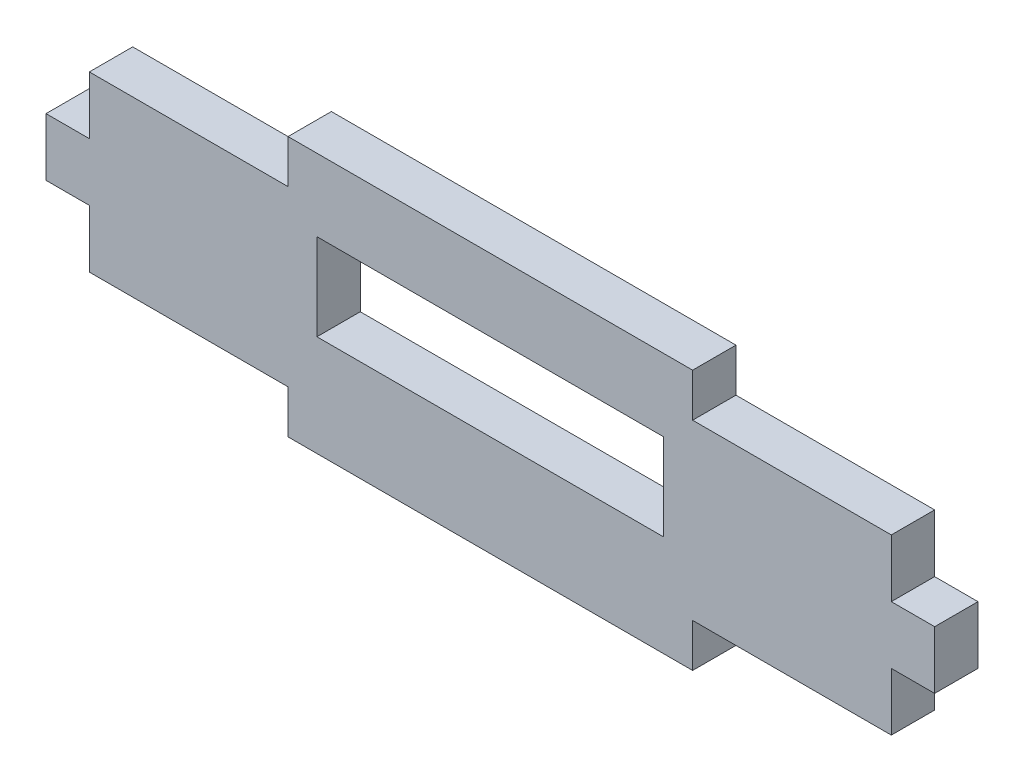
ISO-10303-21;
HEADER;
FILE_DESCRIPTION(('STEP AP214'),'2;1');
FILE_NAME('part.step','',(''),(''),'','','');
FILE_SCHEMA(('AUTOMOTIVE_DESIGN { 1 0 10303 214 1 1 1 1 }'));
ENDSEC;
DATA;
#1=APPLICATION_CONTEXT('core data for automotive mechanical design processes');
#2=APPLICATION_PROTOCOL_DEFINITION('international standard','automotive_design',2000,#1);
#3=PRODUCT_CONTEXT('',#1,'mechanical');
#4=PRODUCT('Part','Part','',(#3));
#5=PRODUCT_RELATED_PRODUCT_CATEGORY('part','',(#4));
#6=PRODUCT_DEFINITION_FORMATION('','',#4);
#7=PRODUCT_DEFINITION_CONTEXT('part definition',#1,'design');
#8=PRODUCT_DEFINITION('design','',#6,#7);
#9=PRODUCT_DEFINITION_SHAPE('','',#8);
#10=(LENGTH_UNIT() NAMED_UNIT(*) SI_UNIT(.MILLI.,.METRE.));
#11=(NAMED_UNIT(*) PLANE_ANGLE_UNIT() SI_UNIT($,.RADIAN.));
#12=(NAMED_UNIT(*) SI_UNIT($,.STERADIAN.) SOLID_ANGLE_UNIT());
#13=UNCERTAINTY_MEASURE_WITH_UNIT(LENGTH_MEASURE(1.E-05),#10,'distance_accuracy_value','');
#14=(GEOMETRIC_REPRESENTATION_CONTEXT(3) GLOBAL_UNCERTAINTY_ASSIGNED_CONTEXT((#13)) GLOBAL_UNIT_ASSIGNED_CONTEXT((#10,
#11,#12)) REPRESENTATION_CONTEXT('',''));
#15=CARTESIAN_POINT('',(0.,0.,0.));
#16=DIRECTION('',(0.,0.,1.));
#17=DIRECTION('',(1.,0.,0.));
#18=AXIS2_PLACEMENT_3D('',#15,#16,#17);
#19=CARTESIAN_POINT('',(0.,0.,3.));
#20=DIRECTION('',(0.,0.,1.));
#21=DIRECTION('',(1.,0.,0.));
#22=AXIS2_PLACEMENT_3D('',#19,#20,#21);
#23=PLANE('',#22);
#24=DIRECTION('',(0.,-1.,0.));
#25=VECTOR('',#24,1.);
#26=CARTESIAN_POINT('',(-14.,-9.,3.));
#27=LINE('',#26,#25);
#28=CARTESIAN_POINT('',(-14.,-6.,3.));
#29=VERTEX_POINT('',#28);
#30=CARTESIAN_POINT('',(-14.,-9.,3.));
#31=VERTEX_POINT('',#30);
#32=EDGE_CURVE('E230',#29,#31,#27,.T.);
#33=ORIENTED_EDGE('',*,*,#32,.T.);
#34=DIRECTION('',(1.,0.,0.));
#35=VECTOR('',#34,1.);
#36=CARTESIAN_POINT('',(-14.,-9.,3.));
#37=LINE('',#36,#35);
#38=CARTESIAN_POINT('',(14.,-9.,3.));
#39=VERTEX_POINT('',#38);
#40=EDGE_CURVE('E233',#31,#39,#37,.T.);
#41=ORIENTED_EDGE('',*,*,#40,.T.);
#42=DIRECTION('',(0.,1.,0.));
#43=VECTOR('',#42,1.);
#44=CARTESIAN_POINT('',(14.,-6.,3.));
#45=LINE('',#44,#43);
#46=CARTESIAN_POINT('',(14.,-6.,3.));
#47=VERTEX_POINT('',#46);
#48=EDGE_CURVE('E236',#39,#47,#45,.T.);
#49=ORIENTED_EDGE('',*,*,#48,.T.);
#50=DIRECTION('',(1.,0.,0.));
#51=VECTOR('',#50,1.);
#52=CARTESIAN_POINT('',(27.75,-6.,3.));
#53=LINE('',#52,#51);
#54=CARTESIAN_POINT('',(27.75,-6.,3.));
#55=VERTEX_POINT('',#54);
#56=EDGE_CURVE('E238',#47,#55,#53,.T.);
#57=ORIENTED_EDGE('',*,*,#56,.T.);
#58=DIRECTION('',(0.,1.,0.));
#59=VECTOR('',#58,1.);
#60=CARTESIAN_POINT('',(27.75,-2.,3.));
#61=LINE('',#60,#59);
#62=CARTESIAN_POINT('',(27.75,-2.,3.));
#63=VERTEX_POINT('',#62);
#64=EDGE_CURVE('E240',#55,#63,#61,.T.);
#65=ORIENTED_EDGE('',*,*,#64,.T.);
#66=DIRECTION('',(1.,0.,0.));
#67=VECTOR('',#66,1.);
#68=CARTESIAN_POINT('',(30.75,-2.,3.));
#69=LINE('',#68,#67);
#70=CARTESIAN_POINT('',(30.75,-2.,3.));
#71=VERTEX_POINT('',#70);
#72=EDGE_CURVE('E242',#63,#71,#69,.T.);
#73=ORIENTED_EDGE('',*,*,#72,.T.);
#74=DIRECTION('',(0.,1.,0.));
#75=VECTOR('',#74,1.);
#76=CARTESIAN_POINT('',(30.75,-2.,3.));
#77=LINE('',#76,#75);
#78=CARTESIAN_POINT('',(30.75,2.,3.));
#79=VERTEX_POINT('',#78);
#80=EDGE_CURVE('E244',#71,#79,#77,.T.);
#81=ORIENTED_EDGE('',*,*,#80,.T.);
#82=DIRECTION('',(-1.,0.,0.));
#83=VECTOR('',#82,1.);
#84=CARTESIAN_POINT('',(30.75,2.,3.));
#85=LINE('',#84,#83);
#86=CARTESIAN_POINT('',(27.75,2.,3.));
#87=VERTEX_POINT('',#86);
#88=EDGE_CURVE('E246',#79,#87,#85,.T.);
#89=ORIENTED_EDGE('',*,*,#88,.T.);
#90=DIRECTION('',(0.,1.,0.));
#91=VECTOR('',#90,1.);
#92=CARTESIAN_POINT('',(27.75,2.,3.));
#93=LINE('',#92,#91);
#94=CARTESIAN_POINT('',(27.75,6.,3.));
#95=VERTEX_POINT('',#94);
#96=EDGE_CURVE('E248',#87,#95,#93,.T.);
#97=ORIENTED_EDGE('',*,*,#96,.T.);
#98=DIRECTION('',(-1.,0.,0.));
#99=VECTOR('',#98,1.);
#100=CARTESIAN_POINT('',(14.,6.,3.));
#101=LINE('',#100,#99);
#102=CARTESIAN_POINT('',(14.,6.,3.));
#103=VERTEX_POINT('',#102);
#104=EDGE_CURVE('E250',#95,#103,#101,.T.);
#105=ORIENTED_EDGE('',*,*,#104,.T.);
#106=DIRECTION('',(0.,1.,0.));
#107=VECTOR('',#106,1.);
#108=CARTESIAN_POINT('',(14.,9.,3.));
#109=LINE('',#108,#107);
#110=CARTESIAN_POINT('',(14.,9.,3.));
#111=VERTEX_POINT('',#110);
#112=EDGE_CURVE('E252',#103,#111,#109,.T.);
#113=ORIENTED_EDGE('',*,*,#112,.T.);
#114=DIRECTION('',(-1.,0.,0.));
#115=VECTOR('',#114,1.);
#116=CARTESIAN_POINT('',(14.,9.,3.));
#117=LINE('',#116,#115);
#118=CARTESIAN_POINT('',(-14.,9.,3.));
#119=VERTEX_POINT('',#118);
#120=EDGE_CURVE('E254',#111,#119,#117,.T.);
#121=ORIENTED_EDGE('',*,*,#120,.T.);
#122=DIRECTION('',(0.,-1.,0.));
#123=VECTOR('',#122,1.);
#124=CARTESIAN_POINT('',(-14.,9.,3.));
#125=LINE('',#124,#123);
#126=CARTESIAN_POINT('',(-14.,6.,3.));
#127=VERTEX_POINT('',#126);
#128=EDGE_CURVE('E256',#119,#127,#125,.T.);
#129=ORIENTED_EDGE('',*,*,#128,.T.);
#130=DIRECTION('',(-1.,0.,0.));
#131=VECTOR('',#130,1.);
#132=CARTESIAN_POINT('',(-27.75,6.,3.));
#133=LINE('',#132,#131);
#134=CARTESIAN_POINT('',(-27.75,6.,3.));
#135=VERTEX_POINT('',#134);
#136=EDGE_CURVE('E258',#127,#135,#133,.T.);
#137=ORIENTED_EDGE('',*,*,#136,.T.);
#138=DIRECTION('',(0.,-1.,0.));
#139=VECTOR('',#138,1.);
#140=CARTESIAN_POINT('',(-27.75,2.,3.));
#141=LINE('',#140,#139);
#142=CARTESIAN_POINT('',(-27.75,2.,3.));
#143=VERTEX_POINT('',#142);
#144=EDGE_CURVE('E260',#135,#143,#141,.T.);
#145=ORIENTED_EDGE('',*,*,#144,.T.);
#146=DIRECTION('',(-1.,0.,0.));
#147=VECTOR('',#146,1.);
#148=CARTESIAN_POINT('',(-30.75,2.,3.));
#149=LINE('',#148,#147);
#150=CARTESIAN_POINT('',(-30.75,2.,3.));
#151=VERTEX_POINT('',#150);
#152=EDGE_CURVE('E262',#143,#151,#149,.T.);
#153=ORIENTED_EDGE('',*,*,#152,.T.);
#154=DIRECTION('',(0.,-1.,0.));
#155=VECTOR('',#154,1.);
#156=CARTESIAN_POINT('',(-30.75,2.,3.));
#157=LINE('',#156,#155);
#158=CARTESIAN_POINT('',(-30.75,-2.,3.));
#159=VERTEX_POINT('',#158);
#160=EDGE_CURVE('E264',#151,#159,#157,.T.);
#161=ORIENTED_EDGE('',*,*,#160,.T.);
#162=DIRECTION('',(1.,0.,0.));
#163=VECTOR('',#162,1.);
#164=CARTESIAN_POINT('',(-30.75,-2.,3.));
#165=LINE('',#164,#163);
#166=CARTESIAN_POINT('',(-27.75,-2.,3.));
#167=VERTEX_POINT('',#166);
#168=EDGE_CURVE('E266',#159,#167,#165,.T.);
#169=ORIENTED_EDGE('',*,*,#168,.T.);
#170=DIRECTION('',(0.,-1.,0.));
#171=VECTOR('',#170,1.);
#172=CARTESIAN_POINT('',(-27.75,-2.,3.));
#173=LINE('',#172,#171);
#174=CARTESIAN_POINT('',(-27.75,-6.,3.));
#175=VERTEX_POINT('',#174);
#176=EDGE_CURVE('E268',#167,#175,#173,.T.);
#177=ORIENTED_EDGE('',*,*,#176,.T.);
#178=DIRECTION('',(1.,0.,0.));
#179=VECTOR('',#178,1.);
#180=CARTESIAN_POINT('',(-14.,-6.,3.));
#181=LINE('',#180,#179);
#182=EDGE_CURVE('E270',#175,#29,#181,.T.);
#183=ORIENTED_EDGE('',*,*,#182,.T.);
#184=EDGE_LOOP('',(#33,#41,#49,#57,#65,#73,#81,#89,#97,#105,#113,#121,#129,#137,#145,#153,#161,
#169,#177,#183));
#185=FACE_BOUND('',#184,.T.);
#186=DIRECTION('',(-1.,0.,0.));
#187=VECTOR('',#186,1.);
#188=CARTESIAN_POINT('',(-12.,4.,3.));
#189=LINE('',#188,#187);
#190=CARTESIAN_POINT('',(12.,4.,3.));
#191=VERTEX_POINT('',#190);
#192=CARTESIAN_POINT('',(-12.,4.,3.));
#193=VERTEX_POINT('',#192);
#194=EDGE_CURVE('E202',#191,#193,#189,.T.);
#195=ORIENTED_EDGE('',*,*,#194,.F.);
#196=DIRECTION('',(0.,1.,0.));
#197=VECTOR('',#196,1.);
#198=CARTESIAN_POINT('',(12.,-2.,3.));
#199=LINE('',#198,#197);
#200=CARTESIAN_POINT('',(12.,-2.,3.));
#201=VERTEX_POINT('',#200);
#202=EDGE_CURVE('E194',#201,#191,#199,.T.);
#203=ORIENTED_EDGE('',*,*,#202,.F.);
#204=DIRECTION('',(1.,0.,0.));
#205=VECTOR('',#204,1.);
#206=CARTESIAN_POINT('',(-12.,-2.,3.));
#207=LINE('',#206,#205);
#208=CARTESIAN_POINT('',(-12.,-2.,3.));
#209=VERTEX_POINT('',#208);
#210=EDGE_CURVE('E216',#209,#201,#207,.T.);
#211=ORIENTED_EDGE('',*,*,#210,.F.);
#212=DIRECTION('',(0.,-1.,0.));
#213=VECTOR('',#212,1.);
#214=CARTESIAN_POINT('',(-12.,-2.,3.));
#215=LINE('',#214,#213);
#216=EDGE_CURVE('E214',#193,#209,#215,.T.);
#217=ORIENTED_EDGE('',*,*,#216,.F.);
#218=EDGE_LOOP('',(#195,#203,#211,#217));
#219=FACE_BOUND('',#218,.T.);
#220=ADVANCED_FACE('F33',(#185,#219),#23,.T.);
#221=CARTESIAN_POINT('',(0.,0.,0.));
#222=DIRECTION('',(0.,0.,1.));
#223=DIRECTION('',(1.,0.,0.));
#224=AXIS2_PLACEMENT_3D('',#221,#222,#223);
#225=PLANE('',#224);
#226=DIRECTION('',(0.,-1.,0.));
#227=VECTOR('',#226,1.);
#228=CARTESIAN_POINT('',(-14.,-9.,0.));
#229=LINE('',#228,#227);
#230=CARTESIAN_POINT('',(-14.,-6.,0.));
#231=VERTEX_POINT('',#230);
#232=CARTESIAN_POINT('',(-14.,-9.,0.));
#233=VERTEX_POINT('',#232);
#234=EDGE_CURVE('E210',#231,#233,#229,.T.);
#235=ORIENTED_EDGE('',*,*,#234,.F.);
#236=DIRECTION('',(1.,0.,0.));
#237=VECTOR('',#236,1.);
#238=CARTESIAN_POINT('',(-14.,-6.,0.));
#239=LINE('',#238,#237);
#240=CARTESIAN_POINT('',(-27.75,-6.,0.));
#241=VERTEX_POINT('',#240);
#242=EDGE_CURVE('E234',#241,#231,#239,.T.);
#243=ORIENTED_EDGE('',*,*,#242,.F.);
#244=DIRECTION('',(0.,-1.,0.));
#245=VECTOR('',#244,1.);
#246=CARTESIAN_POINT('',(-27.75,-2.,0.));
#247=LINE('',#246,#245);
#248=CARTESIAN_POINT('',(-27.75,-2.,0.));
#249=VERTEX_POINT('',#248);
#250=EDGE_CURVE('E309',#249,#241,#247,.T.);
#251=ORIENTED_EDGE('',*,*,#250,.F.);
#252=DIRECTION('',(1.,0.,0.));
#253=VECTOR('',#252,1.);
#254=CARTESIAN_POINT('',(-30.75,-2.,0.));
#255=LINE('',#254,#253);
#256=CARTESIAN_POINT('',(-30.75,-2.,0.));
#257=VERTEX_POINT('',#256);
#258=EDGE_CURVE('E307',#257,#249,#255,.T.);
#259=ORIENTED_EDGE('',*,*,#258,.F.);
#260=DIRECTION('',(0.,-1.,0.));
#261=VECTOR('',#260,1.);
#262=CARTESIAN_POINT('',(-30.75,2.,0.));
#263=LINE('',#262,#261);
#264=CARTESIAN_POINT('',(-30.75,2.,0.));
#265=VERTEX_POINT('',#264);
#266=EDGE_CURVE('E305',#265,#257,#263,.T.);
#267=ORIENTED_EDGE('',*,*,#266,.F.);
#268=DIRECTION('',(-1.,0.,0.));
#269=VECTOR('',#268,1.);
#270=CARTESIAN_POINT('',(-30.75,2.,0.));
#271=LINE('',#270,#269);
#272=CARTESIAN_POINT('',(-27.75,2.,0.));
#273=VERTEX_POINT('',#272);
#274=EDGE_CURVE('E303',#273,#265,#271,.T.);
#275=ORIENTED_EDGE('',*,*,#274,.F.);
#276=DIRECTION('',(0.,-1.,0.));
#277=VECTOR('',#276,1.);
#278=CARTESIAN_POINT('',(-27.75,2.,0.));
#279=LINE('',#278,#277);
#280=CARTESIAN_POINT('',(-27.75,6.,0.));
#281=VERTEX_POINT('',#280);
#282=EDGE_CURVE('E301',#281,#273,#279,.T.);
#283=ORIENTED_EDGE('',*,*,#282,.F.);
#284=DIRECTION('',(-1.,0.,0.));
#285=VECTOR('',#284,1.);
#286=CARTESIAN_POINT('',(-27.75,6.,0.));
#287=LINE('',#286,#285);
#288=CARTESIAN_POINT('',(-14.,6.,0.));
#289=VERTEX_POINT('',#288);
#290=EDGE_CURVE('E299',#289,#281,#287,.T.);
#291=ORIENTED_EDGE('',*,*,#290,.F.);
#292=DIRECTION('',(0.,-1.,0.));
#293=VECTOR('',#292,1.);
#294=CARTESIAN_POINT('',(-14.,9.,0.));
#295=LINE('',#294,#293);
#296=CARTESIAN_POINT('',(-14.,9.,0.));
#297=VERTEX_POINT('',#296);
#298=EDGE_CURVE('E297',#297,#289,#295,.T.);
#299=ORIENTED_EDGE('',*,*,#298,.F.);
#300=DIRECTION('',(-1.,0.,0.));
#301=VECTOR('',#300,1.);
#302=CARTESIAN_POINT('',(14.,9.,0.));
#303=LINE('',#302,#301);
#304=CARTESIAN_POINT('',(14.,9.,0.));
#305=VERTEX_POINT('',#304);
#306=EDGE_CURVE('E295',#305,#297,#303,.T.);
#307=ORIENTED_EDGE('',*,*,#306,.F.);
#308=DIRECTION('',(0.,1.,0.));
#309=VECTOR('',#308,1.);
#310=CARTESIAN_POINT('',(14.,9.,0.));
#311=LINE('',#310,#309);
#312=CARTESIAN_POINT('',(14.,6.,0.));
#313=VERTEX_POINT('',#312);
#314=EDGE_CURVE('E293',#313,#305,#311,.T.);
#315=ORIENTED_EDGE('',*,*,#314,.F.);
#316=DIRECTION('',(-1.,0.,0.));
#317=VECTOR('',#316,1.);
#318=CARTESIAN_POINT('',(14.,6.,0.));
#319=LINE('',#318,#317);
#320=CARTESIAN_POINT('',(27.75,6.,0.));
#321=VERTEX_POINT('',#320);
#322=EDGE_CURVE('E291',#321,#313,#319,.T.);
#323=ORIENTED_EDGE('',*,*,#322,.F.);
#324=DIRECTION('',(0.,1.,0.));
#325=VECTOR('',#324,1.);
#326=CARTESIAN_POINT('',(27.75,2.,0.));
#327=LINE('',#326,#325);
#328=CARTESIAN_POINT('',(27.75,2.,0.));
#329=VERTEX_POINT('',#328);
#330=EDGE_CURVE('E289',#329,#321,#327,.T.);
#331=ORIENTED_EDGE('',*,*,#330,.F.);
#332=DIRECTION('',(-1.,0.,0.));
#333=VECTOR('',#332,1.);
#334=CARTESIAN_POINT('',(30.75,2.,0.));
#335=LINE('',#334,#333);
#336=CARTESIAN_POINT('',(30.75,2.,0.));
#337=VERTEX_POINT('',#336);
#338=EDGE_CURVE('E287',#337,#329,#335,.T.);
#339=ORIENTED_EDGE('',*,*,#338,.F.);
#340=DIRECTION('',(0.,1.,0.));
#341=VECTOR('',#340,1.);
#342=CARTESIAN_POINT('',(30.75,-2.,0.));
#343=LINE('',#342,#341);
#344=CARTESIAN_POINT('',(30.75,-2.,0.));
#345=VERTEX_POINT('',#344);
#346=EDGE_CURVE('E285',#345,#337,#343,.T.);
#347=ORIENTED_EDGE('',*,*,#346,.F.);
#348=DIRECTION('',(1.,0.,0.));
#349=VECTOR('',#348,1.);
#350=CARTESIAN_POINT('',(30.75,-2.,0.));
#351=LINE('',#350,#349);
#352=CARTESIAN_POINT('',(27.75,-2.,0.));
#353=VERTEX_POINT('',#352);
#354=EDGE_CURVE('E283',#353,#345,#351,.T.);
#355=ORIENTED_EDGE('',*,*,#354,.F.);
#356=DIRECTION('',(0.,1.,0.));
#357=VECTOR('',#356,1.);
#358=CARTESIAN_POINT('',(27.75,-2.,0.));
#359=LINE('',#358,#357);
#360=CARTESIAN_POINT('',(27.75,-6.,0.));
#361=VERTEX_POINT('',#360);
#362=EDGE_CURVE('E281',#361,#353,#359,.T.);
#363=ORIENTED_EDGE('',*,*,#362,.F.);
#364=DIRECTION('',(1.,0.,0.));
#365=VECTOR('',#364,1.);
#366=CARTESIAN_POINT('',(27.75,-6.,0.));
#367=LINE('',#366,#365);
#368=CARTESIAN_POINT('',(14.,-6.,0.));
#369=VERTEX_POINT('',#368);
#370=EDGE_CURVE('E279',#369,#361,#367,.T.);
#371=ORIENTED_EDGE('',*,*,#370,.F.);
#372=DIRECTION('',(0.,1.,0.));
#373=VECTOR('',#372,1.);
#374=CARTESIAN_POINT('',(14.,-6.,0.));
#375=LINE('',#374,#373);
#376=CARTESIAN_POINT('',(14.,-9.,0.));
#377=VERTEX_POINT('',#376);
#378=EDGE_CURVE('E277',#377,#369,#375,.T.);
#379=ORIENTED_EDGE('',*,*,#378,.F.);
#380=DIRECTION('',(1.,0.,0.));
#381=VECTOR('',#380,1.);
#382=CARTESIAN_POINT('',(-14.,-9.,0.));
#383=LINE('',#382,#381);
#384=EDGE_CURVE('E275',#233,#377,#383,.T.);
#385=ORIENTED_EDGE('',*,*,#384,.F.);
#386=EDGE_LOOP('',(#235,#243,#251,#259,#267,#275,#283,#291,#299,#307,#315,#323,#331,#339,#347,
#355,#363,#371,#379,#385));
#387=FACE_BOUND('',#386,.T.);
#388=DIRECTION('',(0.,1.,0.));
#389=VECTOR('',#388,1.);
#390=CARTESIAN_POINT('',(12.,-2.,0.));
#391=LINE('',#390,#389);
#392=CARTESIAN_POINT('',(12.,-2.,0.));
#393=VERTEX_POINT('',#392);
#394=CARTESIAN_POINT('',(12.,4.,0.));
#395=VERTEX_POINT('',#394);
#396=EDGE_CURVE('E56',#393,#395,#391,.T.);
#397=ORIENTED_EDGE('',*,*,#396,.T.);
#398=DIRECTION('',(-1.,0.,0.));
#399=VECTOR('',#398,1.);
#400=CARTESIAN_POINT('',(-12.,4.,0.));
#401=LINE('',#400,#399);
#402=CARTESIAN_POINT('',(-12.,4.,0.));
#403=VERTEX_POINT('',#402);
#404=EDGE_CURVE('E209',#395,#403,#401,.T.);
#405=ORIENTED_EDGE('',*,*,#404,.T.);
#406=DIRECTION('',(0.,-1.,0.));
#407=VECTOR('',#406,1.);
#408=CARTESIAN_POINT('',(-12.,-2.,0.));
#409=LINE('',#408,#407);
#410=CARTESIAN_POINT('',(-12.,-2.,0.));
#411=VERTEX_POINT('',#410);
#412=EDGE_CURVE('E222',#403,#411,#409,.T.);
#413=ORIENTED_EDGE('',*,*,#412,.T.);
#414=DIRECTION('',(1.,0.,0.));
#415=VECTOR('',#414,1.);
#416=CARTESIAN_POINT('',(-12.,-2.,0.));
#417=LINE('',#416,#415);
#418=EDGE_CURVE('E203',#411,#393,#417,.T.);
#419=ORIENTED_EDGE('',*,*,#418,.T.);
#420=EDGE_LOOP('',(#397,#405,#413,#419));
#421=FACE_BOUND('',#420,.T.);
#422=ADVANCED_FACE('F375',(#387,#421),#225,.F.);
#423=CARTESIAN_POINT('',(-14.,-9.,3.));
#424=DIRECTION('',(1.,0.,0.));
#425=DIRECTION('',(0.,0.,-1.));
#426=AXIS2_PLACEMENT_3D('',#423,#424,#425);
#427=PLANE('',#426);
#428=ORIENTED_EDGE('',*,*,#234,.T.);
#429=DIRECTION('',(0.,0.,-1.));
#430=VECTOR('',#429,1.);
#431=CARTESIAN_POINT('',(-14.,-9.,3.));
#432=LINE('',#431,#430);
#433=EDGE_CURVE('E11',#31,#233,#432,.T.);
#434=ORIENTED_EDGE('',*,*,#433,.F.);
#435=ORIENTED_EDGE('',*,*,#32,.F.);
#436=DIRECTION('',(0.,0.,-1.));
#437=VECTOR('',#436,1.);
#438=CARTESIAN_POINT('',(-14.,-6.,3.));
#439=LINE('',#438,#437);
#440=EDGE_CURVE('E272',#29,#231,#439,.T.);
#441=ORIENTED_EDGE('',*,*,#440,.T.);
#442=EDGE_LOOP('',(#428,#434,#435,#441));
#443=FACE_BOUND('',#442,.T.);
#444=ADVANCED_FACE('F35',(#443),#427,.F.);
#445=CARTESIAN_POINT('',(-14.,-9.,3.));
#446=DIRECTION('',(0.,1.,0.));
#447=DIRECTION('',(0.,0.,1.));
#448=AXIS2_PLACEMENT_3D('',#445,#446,#447);
#449=PLANE('',#448);
#450=ORIENTED_EDGE('',*,*,#384,.T.);
#451=DIRECTION('',(0.,0.,-1.));
#452=VECTOR('',#451,1.);
#453=CARTESIAN_POINT('',(14.,-9.,3.));
#454=LINE('',#453,#452);
#455=EDGE_CURVE('E41',#39,#377,#454,.T.);
#456=ORIENTED_EDGE('',*,*,#455,.F.);
#457=ORIENTED_EDGE('',*,*,#40,.F.);
#458=ORIENTED_EDGE('',*,*,#433,.T.);
#459=EDGE_LOOP('',(#450,#456,#457,#458));
#460=FACE_BOUND('',#459,.T.);
#461=ADVANCED_FACE('F392',(#460),#449,.F.);
#462=CARTESIAN_POINT('',(14.,-6.,3.));
#463=DIRECTION('',(-1.,0.,0.));
#464=DIRECTION('',(0.,0.,1.));
#465=AXIS2_PLACEMENT_3D('',#462,#463,#464);
#466=PLANE('',#465);
#467=ORIENTED_EDGE('',*,*,#378,.T.);
#468=DIRECTION('',(0.,0.,-1.));
#469=VECTOR('',#468,1.);
#470=CARTESIAN_POINT('',(14.,-6.,3.));
#471=LINE('',#470,#469);
#472=EDGE_CURVE('E362',#47,#369,#471,.T.);
#473=ORIENTED_EDGE('',*,*,#472,.F.);
#474=ORIENTED_EDGE('',*,*,#48,.F.);
#475=ORIENTED_EDGE('',*,*,#455,.T.);
#476=EDGE_LOOP('',(#467,#473,#474,#475));
#477=FACE_BOUND('',#476,.T.);
#478=ADVANCED_FACE('F369',(#477),#466,.F.);
#479=CARTESIAN_POINT('',(27.75,-6.,3.));
#480=DIRECTION('',(0.,1.,0.));
#481=DIRECTION('',(0.,0.,1.));
#482=AXIS2_PLACEMENT_3D('',#479,#480,#481);
#483=PLANE('',#482);
#484=ORIENTED_EDGE('',*,*,#370,.T.);
#485=DIRECTION('',(0.,0.,-1.));
#486=VECTOR('',#485,1.);
#487=CARTESIAN_POINT('',(27.75,-6.,3.));
#488=LINE('',#487,#486);
#489=EDGE_CURVE('E359',#55,#361,#488,.T.);
#490=ORIENTED_EDGE('',*,*,#489,.F.);
#491=ORIENTED_EDGE('',*,*,#56,.F.);
#492=ORIENTED_EDGE('',*,*,#472,.T.);
#493=EDGE_LOOP('',(#484,#490,#491,#492));
#494=FACE_BOUND('',#493,.T.);
#495=ADVANCED_FACE('F381',(#494),#483,.F.);
#496=CARTESIAN_POINT('',(27.75,-2.,3.));
#497=DIRECTION('',(-1.,0.,0.));
#498=DIRECTION('',(0.,0.,1.));
#499=AXIS2_PLACEMENT_3D('',#496,#497,#498);
#500=PLANE('',#499);
#501=ORIENTED_EDGE('',*,*,#362,.T.);
#502=DIRECTION('',(0.,0.,-1.));
#503=VECTOR('',#502,1.);
#504=CARTESIAN_POINT('',(27.75,-2.,3.));
#505=LINE('',#504,#503);
#506=EDGE_CURVE('E356',#63,#353,#505,.T.);
#507=ORIENTED_EDGE('',*,*,#506,.F.);
#508=ORIENTED_EDGE('',*,*,#64,.F.);
#509=ORIENTED_EDGE('',*,*,#489,.T.);
#510=EDGE_LOOP('',(#501,#507,#508,#509));
#511=FACE_BOUND('',#510,.T.);
#512=ADVANCED_FACE('F385',(#511),#500,.F.);
#513=CARTESIAN_POINT('',(30.75,-2.,3.));
#514=DIRECTION('',(0.,1.,0.));
#515=DIRECTION('',(0.,0.,1.));
#516=AXIS2_PLACEMENT_3D('',#513,#514,#515);
#517=PLANE('',#516);
#518=ORIENTED_EDGE('',*,*,#354,.T.);
#519=DIRECTION('',(0.,0.,-1.));
#520=VECTOR('',#519,1.);
#521=CARTESIAN_POINT('',(30.75,-2.,3.));
#522=LINE('',#521,#520);
#523=EDGE_CURVE('E353',#71,#345,#522,.T.);
#524=ORIENTED_EDGE('',*,*,#523,.F.);
#525=ORIENTED_EDGE('',*,*,#72,.F.);
#526=ORIENTED_EDGE('',*,*,#506,.T.);
#527=EDGE_LOOP('',(#518,#524,#525,#526));
#528=FACE_BOUND('',#527,.T.);
#529=ADVANCED_FACE('F465',(#528),#517,.F.);
#530=CARTESIAN_POINT('',(30.75,-2.,3.));
#531=DIRECTION('',(-1.,0.,0.));
#532=DIRECTION('',(0.,0.,1.));
#533=AXIS2_PLACEMENT_3D('',#530,#531,#532);
#534=PLANE('',#533);
#535=ORIENTED_EDGE('',*,*,#346,.T.);
#536=DIRECTION('',(0.,0.,-1.));
#537=VECTOR('',#536,1.);
#538=CARTESIAN_POINT('',(30.75,2.,3.));
#539=LINE('',#538,#537);
#540=EDGE_CURVE('E350',#79,#337,#539,.T.);
#541=ORIENTED_EDGE('',*,*,#540,.F.);
#542=ORIENTED_EDGE('',*,*,#80,.F.);
#543=ORIENTED_EDGE('',*,*,#523,.T.);
#544=EDGE_LOOP('',(#535,#541,#542,#543));
#545=FACE_BOUND('',#544,.T.);
#546=ADVANCED_FACE('F463',(#545),#534,.F.);
#547=CARTESIAN_POINT('',(30.75,2.,3.));
#548=DIRECTION('',(0.,-1.,0.));
#549=DIRECTION('',(1.,0.,0.));
#550=AXIS2_PLACEMENT_3D('',#547,#548,#549);
#551=PLANE('',#550);
#552=ORIENTED_EDGE('',*,*,#338,.T.);
#553=DIRECTION('',(0.,0.,-1.));
#554=VECTOR('',#553,1.);
#555=CARTESIAN_POINT('',(27.75,2.,3.));
#556=LINE('',#555,#554);
#557=EDGE_CURVE('E347',#87,#329,#556,.T.);
#558=ORIENTED_EDGE('',*,*,#557,.F.);
#559=ORIENTED_EDGE('',*,*,#88,.F.);
#560=ORIENTED_EDGE('',*,*,#540,.T.);
#561=EDGE_LOOP('',(#552,#558,#559,#560));
#562=FACE_BOUND('',#561,.T.);
#563=ADVANCED_FACE('F458',(#562),#551,.F.);
#564=CARTESIAN_POINT('',(27.75,2.,3.));
#565=DIRECTION('',(-1.,0.,0.));
#566=DIRECTION('',(0.,0.,1.));
#567=AXIS2_PLACEMENT_3D('',#564,#565,#566);
#568=PLANE('',#567);
#569=ORIENTED_EDGE('',*,*,#330,.T.);
#570=DIRECTION('',(0.,0.,-1.));
#571=VECTOR('',#570,1.);
#572=CARTESIAN_POINT('',(27.75,6.,3.));
#573=LINE('',#572,#571);
#574=EDGE_CURVE('E344',#95,#321,#573,.T.);
#575=ORIENTED_EDGE('',*,*,#574,.F.);
#576=ORIENTED_EDGE('',*,*,#96,.F.);
#577=ORIENTED_EDGE('',*,*,#557,.T.);
#578=EDGE_LOOP('',(#569,#575,#576,#577));
#579=FACE_BOUND('',#578,.T.);
#580=ADVANCED_FACE('F453',(#579),#568,.F.);
#581=CARTESIAN_POINT('',(14.,6.,3.));
#582=DIRECTION('',(0.,-1.,0.));
#583=DIRECTION('',(0.,0.,-1.));
#584=AXIS2_PLACEMENT_3D('',#581,#582,#583);
#585=PLANE('',#584);
#586=ORIENTED_EDGE('',*,*,#322,.T.);
#587=DIRECTION('',(0.,0.,-1.));
#588=VECTOR('',#587,1.);
#589=CARTESIAN_POINT('',(14.,6.,3.));
#590=LINE('',#589,#588);
#591=EDGE_CURVE('E341',#103,#313,#590,.T.);
#592=ORIENTED_EDGE('',*,*,#591,.F.);
#593=ORIENTED_EDGE('',*,*,#104,.F.);
#594=ORIENTED_EDGE('',*,*,#574,.T.);
#595=EDGE_LOOP('',(#586,#592,#593,#594));
#596=FACE_BOUND('',#595,.T.);
#597=ADVANCED_FACE('F449',(#596),#585,.F.);
#598=CARTESIAN_POINT('',(14.,9.,3.));
#599=DIRECTION('',(-1.,0.,0.));
#600=DIRECTION('',(0.,0.,1.));
#601=AXIS2_PLACEMENT_3D('',#598,#599,#600);
#602=PLANE('',#601);
#603=ORIENTED_EDGE('',*,*,#314,.T.);
#604=DIRECTION('',(0.,0.,-1.));
#605=VECTOR('',#604,1.);
#606=CARTESIAN_POINT('',(14.,9.,3.));
#607=LINE('',#606,#605);
#608=EDGE_CURVE('E338',#111,#305,#607,.T.);
#609=ORIENTED_EDGE('',*,*,#608,.F.);
#610=ORIENTED_EDGE('',*,*,#112,.F.);
#611=ORIENTED_EDGE('',*,*,#591,.T.);
#612=EDGE_LOOP('',(#603,#609,#610,#611));
#613=FACE_BOUND('',#612,.T.);
#614=ADVANCED_FACE('F444',(#613),#602,.F.);
#615=CARTESIAN_POINT('',(14.,9.,3.));
#616=DIRECTION('',(0.,-1.,0.));
#617=DIRECTION('',(0.,0.,-1.));
#618=AXIS2_PLACEMENT_3D('',#615,#616,#617);
#619=PLANE('',#618);
#620=ORIENTED_EDGE('',*,*,#306,.T.);
#621=DIRECTION('',(0.,0.,-1.));
#622=VECTOR('',#621,1.);
#623=CARTESIAN_POINT('',(-14.,9.,3.));
#624=LINE('',#623,#622);
#625=EDGE_CURVE('E335',#119,#297,#624,.T.);
#626=ORIENTED_EDGE('',*,*,#625,.F.);
#627=ORIENTED_EDGE('',*,*,#120,.F.);
#628=ORIENTED_EDGE('',*,*,#608,.T.);
#629=EDGE_LOOP('',(#620,#626,#627,#628));
#630=FACE_BOUND('',#629,.T.);
#631=ADVANCED_FACE('F438',(#630),#619,.F.);
#632=CARTESIAN_POINT('',(-14.,9.,3.));
#633=DIRECTION('',(1.,0.,0.));
#634=DIRECTION('',(0.,0.,-1.));
#635=AXIS2_PLACEMENT_3D('',#632,#633,#634);
#636=PLANE('',#635);
#637=ORIENTED_EDGE('',*,*,#298,.T.);
#638=DIRECTION('',(0.,0.,-1.));
#639=VECTOR('',#638,1.);
#640=CARTESIAN_POINT('',(-14.,6.,3.));
#641=LINE('',#640,#639);
#642=EDGE_CURVE('E332',#127,#289,#641,.T.);
#643=ORIENTED_EDGE('',*,*,#642,.F.);
#644=ORIENTED_EDGE('',*,*,#128,.F.);
#645=ORIENTED_EDGE('',*,*,#625,.T.);
#646=EDGE_LOOP('',(#637,#643,#644,#645));
#647=FACE_BOUND('',#646,.T.);
#648=ADVANCED_FACE('F434',(#647),#636,.F.);
#649=CARTESIAN_POINT('',(-27.75,6.,3.));
#650=DIRECTION('',(0.,-1.,0.));
#651=DIRECTION('',(0.,0.,-1.));
#652=AXIS2_PLACEMENT_3D('',#649,#650,#651);
#653=PLANE('',#652);
#654=ORIENTED_EDGE('',*,*,#290,.T.);
#655=DIRECTION('',(0.,0.,-1.));
#656=VECTOR('',#655,1.);
#657=CARTESIAN_POINT('',(-27.75,6.,3.));
#658=LINE('',#657,#656);
#659=EDGE_CURVE('E329',#135,#281,#658,.T.);
#660=ORIENTED_EDGE('',*,*,#659,.F.);
#661=ORIENTED_EDGE('',*,*,#136,.F.);
#662=ORIENTED_EDGE('',*,*,#642,.T.);
#663=EDGE_LOOP('',(#654,#660,#661,#662));
#664=FACE_BOUND('',#663,.T.);
#665=ADVANCED_FACE('F429',(#664),#653,.F.);
#666=CARTESIAN_POINT('',(-27.75,2.,3.));
#667=DIRECTION('',(1.,0.,0.));
#668=DIRECTION('',(0.,0.,-1.));
#669=AXIS2_PLACEMENT_3D('',#666,#667,#668);
#670=PLANE('',#669);
#671=ORIENTED_EDGE('',*,*,#282,.T.);
#672=DIRECTION('',(0.,0.,-1.));
#673=VECTOR('',#672,1.);
#674=CARTESIAN_POINT('',(-27.75,2.,3.));
#675=LINE('',#674,#673);
#676=EDGE_CURVE('E326',#143,#273,#675,.T.);
#677=ORIENTED_EDGE('',*,*,#676,.F.);
#678=ORIENTED_EDGE('',*,*,#144,.F.);
#679=ORIENTED_EDGE('',*,*,#659,.T.);
#680=EDGE_LOOP('',(#671,#677,#678,#679));
#681=FACE_BOUND('',#680,.T.);
#682=ADVANCED_FACE('F423',(#681),#670,.F.);
#683=CARTESIAN_POINT('',(-30.75,2.,3.));
#684=DIRECTION('',(0.,-1.,0.));
#685=DIRECTION('',(0.,0.,-1.));
#686=AXIS2_PLACEMENT_3D('',#683,#684,#685);
#687=PLANE('',#686);
#688=ORIENTED_EDGE('',*,*,#274,.T.);
#689=DIRECTION('',(0.,0.,-1.));
#690=VECTOR('',#689,1.);
#691=CARTESIAN_POINT('',(-30.75,2.,3.));
#692=LINE('',#691,#690);
#693=EDGE_CURVE('E323',#151,#265,#692,.T.);
#694=ORIENTED_EDGE('',*,*,#693,.F.);
#695=ORIENTED_EDGE('',*,*,#152,.F.);
#696=ORIENTED_EDGE('',*,*,#676,.T.);
#697=EDGE_LOOP('',(#688,#694,#695,#696));
#698=FACE_BOUND('',#697,.T.);
#699=ADVANCED_FACE('F419',(#698),#687,.F.);
#700=CARTESIAN_POINT('',(-30.75,2.,3.));
#701=DIRECTION('',(1.,0.,0.));
#702=DIRECTION('',(0.,0.,-1.));
#703=AXIS2_PLACEMENT_3D('',#700,#701,#702);
#704=PLANE('',#703);
#705=ORIENTED_EDGE('',*,*,#266,.T.);
#706=DIRECTION('',(0.,0.,-1.));
#707=VECTOR('',#706,1.);
#708=CARTESIAN_POINT('',(-30.75,-2.,3.));
#709=LINE('',#708,#707);
#710=EDGE_CURVE('E320',#159,#257,#709,.T.);
#711=ORIENTED_EDGE('',*,*,#710,.F.);
#712=ORIENTED_EDGE('',*,*,#160,.F.);
#713=ORIENTED_EDGE('',*,*,#693,.T.);
#714=EDGE_LOOP('',(#705,#711,#712,#713));
#715=FACE_BOUND('',#714,.T.);
#716=ADVANCED_FACE('F414',(#715),#704,.F.);
#717=CARTESIAN_POINT('',(-30.75,-2.,3.));
#718=DIRECTION('',(0.,1.,0.));
#719=DIRECTION('',(0.,0.,1.));
#720=AXIS2_PLACEMENT_3D('',#717,#718,#719);
#721=PLANE('',#720);
#722=ORIENTED_EDGE('',*,*,#258,.T.);
#723=DIRECTION('',(0.,0.,-1.));
#724=VECTOR('',#723,1.);
#725=CARTESIAN_POINT('',(-27.75,-2.,3.));
#726=LINE('',#725,#724);
#727=EDGE_CURVE('E317',#167,#249,#726,.T.);
#728=ORIENTED_EDGE('',*,*,#727,.F.);
#729=ORIENTED_EDGE('',*,*,#168,.F.);
#730=ORIENTED_EDGE('',*,*,#710,.T.);
#731=EDGE_LOOP('',(#722,#728,#729,#730));
#732=FACE_BOUND('',#731,.T.);
#733=ADVANCED_FACE('F408',(#732),#721,.F.);
#734=CARTESIAN_POINT('',(-27.75,-2.,3.));
#735=DIRECTION('',(1.,0.,0.));
#736=DIRECTION('',(0.,0.,-1.));
#737=AXIS2_PLACEMENT_3D('',#734,#735,#736);
#738=PLANE('',#737);
#739=ORIENTED_EDGE('',*,*,#250,.T.);
#740=DIRECTION('',(0.,0.,-1.));
#741=VECTOR('',#740,1.);
#742=CARTESIAN_POINT('',(-27.75,-6.,3.));
#743=LINE('',#742,#741);
#744=EDGE_CURVE('E314',#175,#241,#743,.T.);
#745=ORIENTED_EDGE('',*,*,#744,.F.);
#746=ORIENTED_EDGE('',*,*,#176,.F.);
#747=ORIENTED_EDGE('',*,*,#727,.T.);
#748=EDGE_LOOP('',(#739,#745,#746,#747));
#749=FACE_BOUND('',#748,.T.);
#750=ADVANCED_FACE('F404',(#749),#738,.F.);
#751=CARTESIAN_POINT('',(-14.,-6.,3.));
#752=DIRECTION('',(0.,1.,0.));
#753=DIRECTION('',(0.,0.,1.));
#754=AXIS2_PLACEMENT_3D('',#751,#752,#753);
#755=PLANE('',#754);
#756=ORIENTED_EDGE('',*,*,#242,.T.);
#757=ORIENTED_EDGE('',*,*,#440,.F.);
#758=ORIENTED_EDGE('',*,*,#182,.F.);
#759=ORIENTED_EDGE('',*,*,#744,.T.);
#760=EDGE_LOOP('',(#756,#757,#758,#759));
#761=FACE_BOUND('',#760,.T.);
#762=ADVANCED_FACE('F399',(#761),#755,.F.);
#763=CARTESIAN_POINT('',(12.,-2.,3.));
#764=DIRECTION('',(-1.,0.,0.));
#765=DIRECTION('',(0.,0.,1.));
#766=AXIS2_PLACEMENT_3D('',#763,#764,#765);
#767=PLANE('',#766);
#768=ORIENTED_EDGE('',*,*,#396,.F.);
#769=DIRECTION('',(0.,0.,-1.));
#770=VECTOR('',#769,1.);
#771=CARTESIAN_POINT('',(12.,-2.,3.));
#772=LINE('',#771,#770);
#773=EDGE_CURVE('E198',#201,#393,#772,.T.);
#774=ORIENTED_EDGE('',*,*,#773,.F.);
#775=ORIENTED_EDGE('',*,*,#202,.T.);
#776=DIRECTION('',(0.,0.,-1.));
#777=VECTOR('',#776,1.);
#778=CARTESIAN_POINT('',(12.,4.,3.));
#779=LINE('',#778,#777);
#780=EDGE_CURVE('E197',#191,#395,#779,.T.);
#781=ORIENTED_EDGE('',*,*,#780,.T.);
#782=EDGE_LOOP('',(#768,#774,#775,#781));
#783=FACE_BOUND('',#782,.T.);
#784=ADVANCED_FACE('F196',(#783),#767,.T.);
#785=CARTESIAN_POINT('',(-12.,4.,3.));
#786=DIRECTION('',(0.,-1.,0.));
#787=DIRECTION('',(0.,0.,-1.));
#788=AXIS2_PLACEMENT_3D('',#785,#786,#787);
#789=PLANE('',#788);
#790=ORIENTED_EDGE('',*,*,#404,.F.);
#791=ORIENTED_EDGE('',*,*,#780,.F.);
#792=ORIENTED_EDGE('',*,*,#194,.T.);
#793=DIRECTION('',(0.,0.,-1.));
#794=VECTOR('',#793,1.);
#795=CARTESIAN_POINT('',(-12.,4.,3.));
#796=LINE('',#795,#794);
#797=EDGE_CURVE('E211',#193,#403,#796,.T.);
#798=ORIENTED_EDGE('',*,*,#797,.T.);
#799=EDGE_LOOP('',(#790,#791,#792,#798));
#800=FACE_BOUND('',#799,.T.);
#801=ADVANCED_FACE('F206',(#800),#789,.T.);
#802=CARTESIAN_POINT('',(-12.,-2.,3.));
#803=DIRECTION('',(1.,0.,0.));
#804=DIRECTION('',(0.,0.,-1.));
#805=AXIS2_PLACEMENT_3D('',#802,#803,#804);
#806=PLANE('',#805);
#807=ORIENTED_EDGE('',*,*,#412,.F.);
#808=ORIENTED_EDGE('',*,*,#797,.F.);
#809=ORIENTED_EDGE('',*,*,#216,.T.);
#810=DIRECTION('',(0.,0.,-1.));
#811=VECTOR('',#810,1.);
#812=CARTESIAN_POINT('',(-12.,-2.,3.));
#813=LINE('',#812,#811);
#814=EDGE_CURVE('E48',#209,#411,#813,.T.);
#815=ORIENTED_EDGE('',*,*,#814,.T.);
#816=EDGE_LOOP('',(#807,#808,#809,#815));
#817=FACE_BOUND('',#816,.T.);
#818=ADVANCED_FACE('F571',(#817),#806,.T.);
#819=CARTESIAN_POINT('',(-12.,-2.,3.));
#820=DIRECTION('',(0.,1.,0.));
#821=DIRECTION('',(0.,0.,1.));
#822=AXIS2_PLACEMENT_3D('',#819,#820,#821);
#823=PLANE('',#822);
#824=ORIENTED_EDGE('',*,*,#418,.F.);
#825=ORIENTED_EDGE('',*,*,#814,.F.);
#826=ORIENTED_EDGE('',*,*,#210,.T.);
#827=ORIENTED_EDGE('',*,*,#773,.T.);
#828=EDGE_LOOP('',(#824,#825,#826,#827));
#829=FACE_BOUND('',#828,.T.);
#830=ADVANCED_FACE('F577',(#829),#823,.T.);
#831=CLOSED_SHELL('',(#220,#422,#444,#461,#478,#495,#512,#529,#546,#563,#580,#597,#614,#631,
#648,#665,#682,#699,#716,#733,#750,#762,#784,#801,#818,#830));
#832=MANIFOLD_SOLID_BREP('B2',#831);
#833=ADVANCED_BREP_SHAPE_REPRESENTATION('',(#18,#832),#14);
#834=SHAPE_DEFINITION_REPRESENTATION(#9,#833);
ENDSEC;
END-ISO-10303-21;
